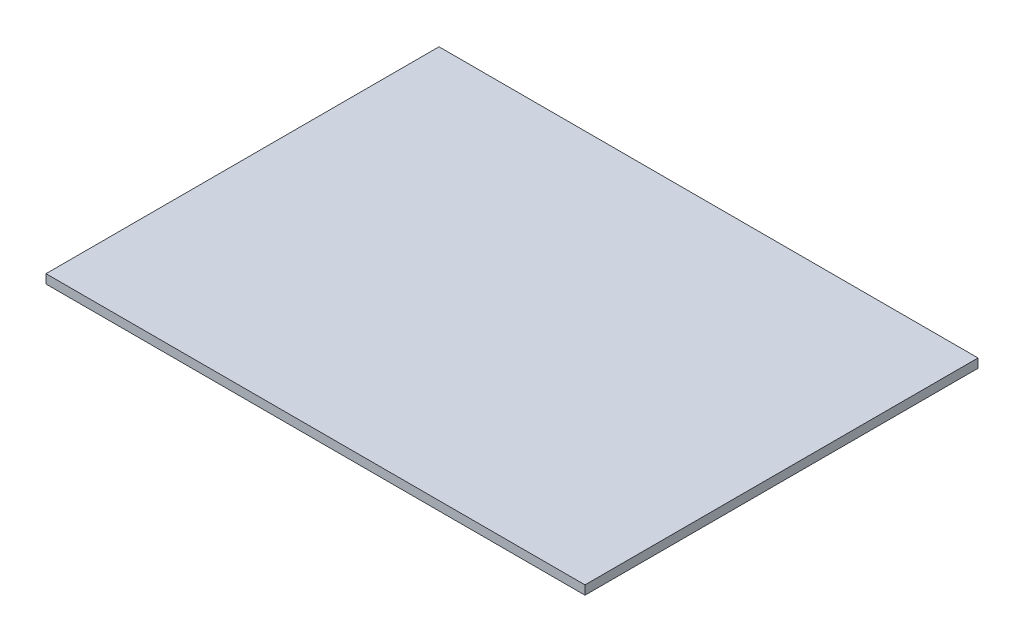
ISO-10303-21;
HEADER;
FILE_DESCRIPTION(('STEP AP214'),'2;1');
FILE_NAME('part.step','',(''),(''),'','','');
FILE_SCHEMA(('AUTOMOTIVE_DESIGN { 1 0 10303 214 1 1 1 1 }'));
ENDSEC;
DATA;
#1=APPLICATION_CONTEXT('core data for automotive mechanical design processes');
#2=APPLICATION_PROTOCOL_DEFINITION('international standard','automotive_design',2000,#1);
#3=PRODUCT_CONTEXT('',#1,'mechanical');
#4=PRODUCT('Part','Part','',(#3));
#5=PRODUCT_RELATED_PRODUCT_CATEGORY('part','',(#4));
#6=PRODUCT_DEFINITION_FORMATION('','',#4);
#7=PRODUCT_DEFINITION_CONTEXT('part definition',#1,'design');
#8=PRODUCT_DEFINITION('design','',#6,#7);
#9=PRODUCT_DEFINITION_SHAPE('','',#8);
#10=(LENGTH_UNIT() NAMED_UNIT(*) SI_UNIT(.MILLI.,.METRE.));
#11=(NAMED_UNIT(*) PLANE_ANGLE_UNIT() SI_UNIT($,.RADIAN.));
#12=(NAMED_UNIT(*) SI_UNIT($,.STERADIAN.) SOLID_ANGLE_UNIT());
#13=UNCERTAINTY_MEASURE_WITH_UNIT(LENGTH_MEASURE(1.E-05),#10,'distance_accuracy_value','');
#14=(GEOMETRIC_REPRESENTATION_CONTEXT(3) GLOBAL_UNCERTAINTY_ASSIGNED_CONTEXT((#13)) GLOBAL_UNIT_ASSIGNED_CONTEXT((#10,
#11,#12)) REPRESENTATION_CONTEXT('',''));
#15=CARTESIAN_POINT('',(0.,0.,0.));
#16=DIRECTION('',(0.,0.,1.));
#17=DIRECTION('',(1.,0.,0.));
#18=AXIS2_PLACEMENT_3D('',#15,#16,#17);
#19=CARTESIAN_POINT('',(0.,0.8,35.));
#20=DIRECTION('',(1.,0.,0.));
#21=DIRECTION('',(0.,0.,-1.));
#22=AXIS2_PLACEMENT_3D('',#19,#20,#21);
#23=PLANE('',#22);
#24=DIRECTION('',(0.,0.,1.));
#25=VECTOR('',#24,1.);
#26=CARTESIAN_POINT('',(0.,-0.8,35.));
#27=LINE('',#26,#25);
#28=CARTESIAN_POINT('',(0.,-0.8,-35.));
#29=VERTEX_POINT('',#28);
#30=CARTESIAN_POINT('',(0.,-0.8,35.));
#31=VERTEX_POINT('',#30);
#32=EDGE_CURVE('E102',#29,#31,#27,.T.);
#33=ORIENTED_EDGE('',*,*,#32,.T.);
#34=DIRECTION('',(0.,-1.,0.));
#35=VECTOR('',#34,1.);
#36=CARTESIAN_POINT('',(0.,0.8,35.));
#37=LINE('',#36,#35);
#38=CARTESIAN_POINT('',(0.,0.8,35.));
#39=VERTEX_POINT('',#38);
#40=EDGE_CURVE('E11',#39,#31,#37,.T.);
#41=ORIENTED_EDGE('',*,*,#40,.F.);
#42=DIRECTION('',(0.,0.,1.));
#43=VECTOR('',#42,1.);
#44=CARTESIAN_POINT('',(0.,0.8,35.));
#45=LINE('',#44,#43);
#46=CARTESIAN_POINT('',(0.,0.8,-35.));
#47=VERTEX_POINT('',#46);
#48=EDGE_CURVE('E90',#47,#39,#45,.T.);
#49=ORIENTED_EDGE('',*,*,#48,.F.);
#50=DIRECTION('',(0.,-1.,0.));
#51=VECTOR('',#50,1.);
#52=CARTESIAN_POINT('',(0.,0.8,-35.));
#53=LINE('',#52,#51);
#54=EDGE_CURVE('E98',#47,#29,#53,.T.);
#55=ORIENTED_EDGE('',*,*,#54,.T.);
#56=EDGE_LOOP('',(#33,#41,#49,#55));
#57=FACE_BOUND('',#56,.T.);
#58=ADVANCED_FACE('F39',(#57),#23,.F.);
#59=CARTESIAN_POINT('',(96.,0.8,35.));
#60=DIRECTION('',(0.,0.,-1.));
#61=DIRECTION('',(-1.,0.,0.));
#62=AXIS2_PLACEMENT_3D('',#59,#60,#61);
#63=PLANE('',#62);
#64=DIRECTION('',(1.,0.,0.));
#65=VECTOR('',#64,1.);
#66=CARTESIAN_POINT('',(96.,-0.8,35.));
#67=LINE('',#66,#65);
#68=CARTESIAN_POINT('',(96.,-0.8,35.));
#69=VERTEX_POINT('',#68);
#70=EDGE_CURVE('E94',#31,#69,#67,.T.);
#71=ORIENTED_EDGE('',*,*,#70,.T.);
#72=DIRECTION('',(0.,-1.,0.));
#73=VECTOR('',#72,1.);
#74=CARTESIAN_POINT('',(96.,0.8,35.));
#75=LINE('',#74,#73);
#76=CARTESIAN_POINT('',(96.,0.8,35.));
#77=VERTEX_POINT('',#76);
#78=EDGE_CURVE('E47',#77,#69,#75,.T.);
#79=ORIENTED_EDGE('',*,*,#78,.F.);
#80=DIRECTION('',(1.,0.,0.));
#81=VECTOR('',#80,1.);
#82=CARTESIAN_POINT('',(96.,0.8,35.));
#83=LINE('',#82,#81);
#84=EDGE_CURVE('E85',#39,#77,#83,.T.);
#85=ORIENTED_EDGE('',*,*,#84,.F.);
#86=ORIENTED_EDGE('',*,*,#40,.T.);
#87=EDGE_LOOP('',(#71,#79,#85,#86));
#88=FACE_BOUND('',#87,.T.);
#89=ADVANCED_FACE('F93',(#88),#63,.F.);
#90=CARTESIAN_POINT('',(96.,0.8,-35.));
#91=DIRECTION('',(-1.,0.,0.));
#92=DIRECTION('',(0.,0.,1.));
#93=AXIS2_PLACEMENT_3D('',#90,#91,#92);
#94=PLANE('',#93);
#95=DIRECTION('',(0.,0.,-1.));
#96=VECTOR('',#95,1.);
#97=CARTESIAN_POINT('',(96.,-0.8,-35.));
#98=LINE('',#97,#96);
#99=CARTESIAN_POINT('',(96.,-0.8,-35.));
#100=VERTEX_POINT('',#99);
#101=EDGE_CURVE('E72',#69,#100,#98,.T.);
#102=ORIENTED_EDGE('',*,*,#101,.T.);
#103=DIRECTION('',(0.,-1.,0.));
#104=VECTOR('',#103,1.);
#105=CARTESIAN_POINT('',(96.,0.8,-35.));
#106=LINE('',#105,#104);
#107=CARTESIAN_POINT('',(96.,0.8,-35.));
#108=VERTEX_POINT('',#107);
#109=EDGE_CURVE('E95',#108,#100,#106,.T.);
#110=ORIENTED_EDGE('',*,*,#109,.F.);
#111=DIRECTION('',(0.,0.,-1.));
#112=VECTOR('',#111,1.);
#113=CARTESIAN_POINT('',(96.,0.8,-35.));
#114=LINE('',#113,#112);
#115=EDGE_CURVE('E88',#77,#108,#114,.T.);
#116=ORIENTED_EDGE('',*,*,#115,.F.);
#117=ORIENTED_EDGE('',*,*,#78,.T.);
#118=EDGE_LOOP('',(#102,#110,#116,#117));
#119=FACE_BOUND('',#118,.T.);
#120=ADVANCED_FACE('F96',(#119),#94,.F.);
#121=CARTESIAN_POINT('',(0.,0.8,-35.));
#122=DIRECTION('',(0.,0.,1.));
#123=DIRECTION('',(1.,0.,0.));
#124=AXIS2_PLACEMENT_3D('',#121,#122,#123);
#125=PLANE('',#124);
#126=DIRECTION('',(-1.,0.,0.));
#127=VECTOR('',#126,1.);
#128=CARTESIAN_POINT('',(0.,-0.8,-35.));
#129=LINE('',#128,#127);
#130=EDGE_CURVE('E78',#100,#29,#129,.T.);
#131=ORIENTED_EDGE('',*,*,#130,.T.);
#132=ORIENTED_EDGE('',*,*,#54,.F.);
#133=DIRECTION('',(-1.,0.,0.));
#134=VECTOR('',#133,1.);
#135=CARTESIAN_POINT('',(0.,0.8,-35.));
#136=LINE('',#135,#134);
#137=EDGE_CURVE('E55',#108,#47,#136,.T.);
#138=ORIENTED_EDGE('',*,*,#137,.F.);
#139=ORIENTED_EDGE('',*,*,#109,.T.);
#140=EDGE_LOOP('',(#131,#132,#138,#139));
#141=FACE_BOUND('',#140,.T.);
#142=ADVANCED_FACE('F109',(#141),#125,.F.);
#143=CARTESIAN_POINT('',(0.,0.8,0.));
#144=DIRECTION('',(0.,-1.,0.));
#145=DIRECTION('',(0.,0.,-1.));
#146=AXIS2_PLACEMENT_3D('',#143,#144,#145);
#147=PLANE('',#146);
#148=ORIENTED_EDGE('',*,*,#48,.T.);
#149=ORIENTED_EDGE('',*,*,#84,.T.);
#150=ORIENTED_EDGE('',*,*,#115,.T.);
#151=ORIENTED_EDGE('',*,*,#137,.T.);
#152=EDGE_LOOP('',(#148,#149,#150,#151));
#153=FACE_BOUND('',#152,.T.);
#154=ADVANCED_FACE('F86',(#153),#147,.F.);
#155=CARTESIAN_POINT('',(0.,-0.8,0.));
#156=DIRECTION('',(0.,-1.,0.));
#157=DIRECTION('',(0.,0.,-1.));
#158=AXIS2_PLACEMENT_3D('',#155,#156,#157);
#159=PLANE('',#158);
#160=ORIENTED_EDGE('',*,*,#32,.F.);
#161=ORIENTED_EDGE('',*,*,#130,.F.);
#162=ORIENTED_EDGE('',*,*,#101,.F.);
#163=ORIENTED_EDGE('',*,*,#70,.F.);
#164=EDGE_LOOP('',(#160,#161,#162,#163));
#165=FACE_BOUND('',#164,.T.);
#166=ADVANCED_FACE('F112',(#165),#159,.T.);
#167=CLOSED_SHELL('',(#58,#89,#120,#142,#154,#166));
#168=MANIFOLD_SOLID_BREP('B2',#167);
#169=ADVANCED_BREP_SHAPE_REPRESENTATION('',(#18,#168),#14);
#170=SHAPE_DEFINITION_REPRESENTATION(#9,#169);
ENDSEC;
END-ISO-10303-21;
